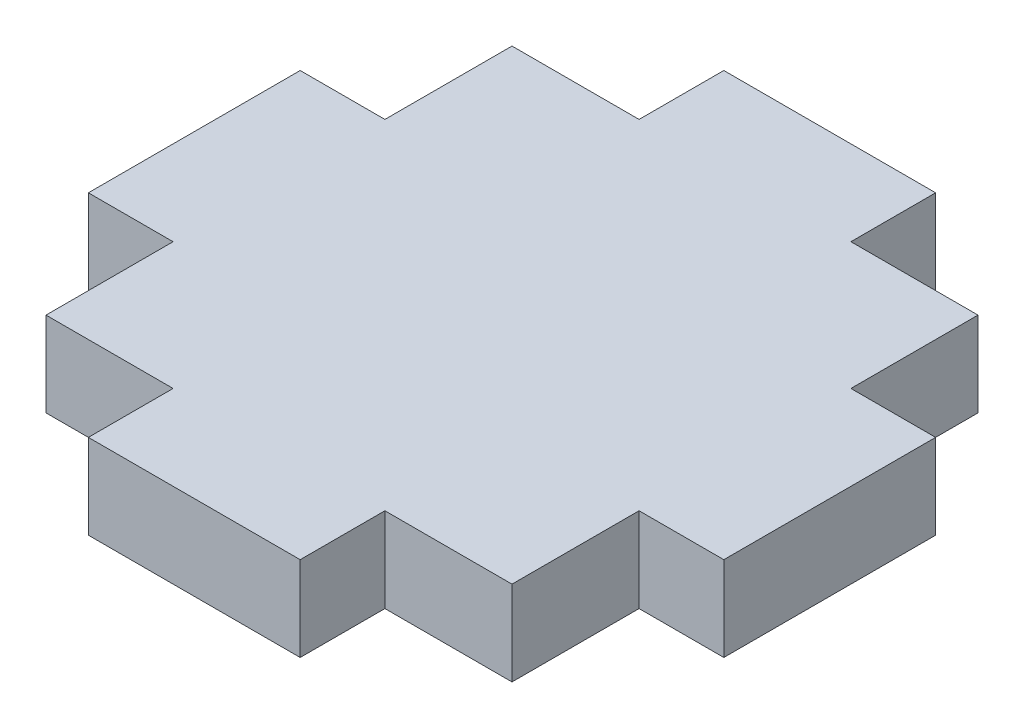
ISO-10303-21;
HEADER;
FILE_DESCRIPTION(('STEP AP214'),'2;1');
FILE_NAME('part.step','',(''),(''),'','','');
FILE_SCHEMA(('AUTOMOTIVE_DESIGN { 1 0 10303 214 1 1 1 1 }'));
ENDSEC;
DATA;
#1=APPLICATION_CONTEXT('core data for automotive mechanical design processes');
#2=APPLICATION_PROTOCOL_DEFINITION('international standard','automotive_design',2000,#1);
#3=PRODUCT_CONTEXT('',#1,'mechanical');
#4=PRODUCT('Part','Part','',(#3));
#5=PRODUCT_RELATED_PRODUCT_CATEGORY('part','',(#4));
#6=PRODUCT_DEFINITION_FORMATION('','',#4);
#7=PRODUCT_DEFINITION_CONTEXT('part definition',#1,'design');
#8=PRODUCT_DEFINITION('design','',#6,#7);
#9=PRODUCT_DEFINITION_SHAPE('','',#8);
#10=(LENGTH_UNIT() NAMED_UNIT(*) SI_UNIT(.MILLI.,.METRE.));
#11=(NAMED_UNIT(*) PLANE_ANGLE_UNIT() SI_UNIT($,.RADIAN.));
#12=(NAMED_UNIT(*) SI_UNIT($,.STERADIAN.) SOLID_ANGLE_UNIT());
#13=UNCERTAINTY_MEASURE_WITH_UNIT(LENGTH_MEASURE(1.E-05),#10,'distance_accuracy_value','');
#14=(GEOMETRIC_REPRESENTATION_CONTEXT(3) GLOBAL_UNCERTAINTY_ASSIGNED_CONTEXT((#13)) GLOBAL_UNIT_ASSIGNED_CONTEXT((#10,
#11,#12)) REPRESENTATION_CONTEXT('',''));
#15=CARTESIAN_POINT('',(0.,0.,0.));
#16=DIRECTION('',(0.,0.,1.));
#17=DIRECTION('',(1.,0.,0.));
#18=AXIS2_PLACEMENT_3D('',#15,#16,#17);
#19=CARTESIAN_POINT('',(26.,4.,0.));
#20=DIRECTION('',(-1.,0.,0.));
#21=DIRECTION('',(0.,0.,1.));
#22=AXIS2_PLACEMENT_3D('',#19,#20,#21);
#23=PLANE('',#22);
#24=DIRECTION('',(0.,0.,-1.));
#25=VECTOR('',#24,1.);
#26=CARTESIAN_POINT('',(26.,0.,0.));
#27=LINE('',#26,#25);
#28=CARTESIAN_POINT('',(26.,0.,-4.));
#29=VERTEX_POINT('',#28);
#30=CARTESIAN_POINT('',(26.,0.,-10.));
#31=VERTEX_POINT('',#30);
#32=EDGE_CURVE('E204',#29,#31,#27,.T.);
#33=ORIENTED_EDGE('',*,*,#32,.T.);
#34=DIRECTION('',(0.,-1.,0.));
#35=VECTOR('',#34,1.);
#36=CARTESIAN_POINT('',(26.,4.,-10.));
#37=LINE('',#36,#35);
#38=CARTESIAN_POINT('',(26.,4.,-10.));
#39=VERTEX_POINT('',#38);
#40=EDGE_CURVE('E11',#39,#31,#37,.T.);
#41=ORIENTED_EDGE('',*,*,#40,.F.);
#42=DIRECTION('',(0.,0.,-1.));
#43=VECTOR('',#42,1.);
#44=CARTESIAN_POINT('',(26.,4.,0.));
#45=LINE('',#44,#43);
#46=CARTESIAN_POINT('',(26.,4.,-4.));
#47=VERTEX_POINT('',#46);
#48=EDGE_CURVE('E306',#47,#39,#45,.T.);
#49=ORIENTED_EDGE('',*,*,#48,.F.);
#50=DIRECTION('',(0.,-1.,0.));
#51=VECTOR('',#50,1.);
#52=CARTESIAN_POINT('',(26.,4.,-4.));
#53=LINE('',#52,#51);
#54=EDGE_CURVE('E199',#47,#29,#53,.T.);
#55=ORIENTED_EDGE('',*,*,#54,.T.);
#56=EDGE_LOOP('',(#33,#41,#49,#55));
#57=FACE_BOUND('',#56,.T.);
#58=ADVANCED_FACE('F35',(#57),#23,.F.);
#59=CARTESIAN_POINT('',(0.,4.,-10.));
#60=DIRECTION('',(0.,0.,-1.));
#61=DIRECTION('',(-1.,0.,0.));
#62=AXIS2_PLACEMENT_3D('',#59,#60,#61);
#63=PLANE('',#62);
#64=DIRECTION('',(1.,0.,0.));
#65=VECTOR('',#64,1.);
#66=CARTESIAN_POINT('',(0.,0.,-10.));
#67=LINE('',#66,#65);
#68=CARTESIAN_POINT('',(30.,0.,-10.));
#69=VERTEX_POINT('',#68);
#70=EDGE_CURVE('E207',#31,#69,#67,.T.);
#71=ORIENTED_EDGE('',*,*,#70,.T.);
#72=DIRECTION('',(0.,-1.,0.));
#73=VECTOR('',#72,1.);
#74=CARTESIAN_POINT('',(30.,4.,-10.));
#75=LINE('',#74,#73);
#76=CARTESIAN_POINT('',(30.,4.,-10.));
#77=VERTEX_POINT('',#76);
#78=EDGE_CURVE('E44',#77,#69,#75,.T.);
#79=ORIENTED_EDGE('',*,*,#78,.F.);
#80=DIRECTION('',(1.,0.,0.));
#81=VECTOR('',#80,1.);
#82=CARTESIAN_POINT('',(0.,4.,-10.));
#83=LINE('',#82,#81);
#84=EDGE_CURVE('E127',#39,#77,#83,.T.);
#85=ORIENTED_EDGE('',*,*,#84,.F.);
#86=ORIENTED_EDGE('',*,*,#40,.T.);
#87=EDGE_LOOP('',(#71,#79,#85,#86));
#88=FACE_BOUND('',#87,.T.);
#89=ADVANCED_FACE('F37',(#88),#63,.F.);
#90=CARTESIAN_POINT('',(30.,4.,0.));
#91=DIRECTION('',(-1.,0.,0.));
#92=DIRECTION('',(0.,0.,1.));
#93=AXIS2_PLACEMENT_3D('',#90,#91,#92);
#94=PLANE('',#93);
#95=DIRECTION('',(0.,0.,-1.));
#96=VECTOR('',#95,1.);
#97=CARTESIAN_POINT('',(30.,0.,0.));
#98=LINE('',#97,#96);
#99=CARTESIAN_POINT('',(30.,0.,-20.));
#100=VERTEX_POINT('',#99);
#101=EDGE_CURVE('E210',#69,#100,#98,.T.);
#102=ORIENTED_EDGE('',*,*,#101,.T.);
#103=DIRECTION('',(0.,-1.,0.));
#104=VECTOR('',#103,1.);
#105=CARTESIAN_POINT('',(30.,4.,-20.));
#106=LINE('',#105,#104);
#107=CARTESIAN_POINT('',(30.,4.,-20.));
#108=VERTEX_POINT('',#107);
#109=EDGE_CURVE('E282',#108,#100,#106,.T.);
#110=ORIENTED_EDGE('',*,*,#109,.F.);
#111=DIRECTION('',(0.,0.,-1.));
#112=VECTOR('',#111,1.);
#113=CARTESIAN_POINT('',(30.,4.,0.));
#114=LINE('',#113,#112);
#115=EDGE_CURVE('E289',#77,#108,#114,.T.);
#116=ORIENTED_EDGE('',*,*,#115,.F.);
#117=ORIENTED_EDGE('',*,*,#78,.T.);
#118=EDGE_LOOP('',(#102,#110,#116,#117));
#119=FACE_BOUND('',#118,.T.);
#120=ADVANCED_FACE('F287',(#119),#94,.F.);
#121=CARTESIAN_POINT('',(0.,4.,-20.));
#122=DIRECTION('',(0.,0.,-1.));
#123=DIRECTION('',(-1.,0.,0.));
#124=AXIS2_PLACEMENT_3D('',#121,#122,#123);
#125=PLANE('',#124);
#126=DIRECTION('',(1.,0.,0.));
#127=VECTOR('',#126,1.);
#128=CARTESIAN_POINT('',(0.,0.,-20.));
#129=LINE('',#128,#127);
#130=CARTESIAN_POINT('',(26.,0.,-20.));
#131=VERTEX_POINT('',#130);
#132=EDGE_CURVE('E213',#131,#100,#129,.T.);
#133=ORIENTED_EDGE('',*,*,#132,.F.);
#134=DIRECTION('',(0.,-1.,0.));
#135=VECTOR('',#134,1.);
#136=CARTESIAN_POINT('',(26.,4.,-20.));
#137=LINE('',#136,#135);
#138=CARTESIAN_POINT('',(26.,4.,-20.));
#139=VERTEX_POINT('',#138);
#140=EDGE_CURVE('E280',#139,#131,#137,.T.);
#141=ORIENTED_EDGE('',*,*,#140,.F.);
#142=DIRECTION('',(1.,0.,0.));
#143=VECTOR('',#142,1.);
#144=CARTESIAN_POINT('',(0.,4.,-20.));
#145=LINE('',#144,#143);
#146=EDGE_CURVE('E301',#139,#108,#145,.T.);
#147=ORIENTED_EDGE('',*,*,#146,.T.);
#148=ORIENTED_EDGE('',*,*,#109,.T.);
#149=EDGE_LOOP('',(#133,#141,#147,#148));
#150=FACE_BOUND('',#149,.T.);
#151=ADVANCED_FACE('F297',(#150),#125,.T.);
#152=CARTESIAN_POINT('',(26.,0.,-26.));
#153=VERTEX_POINT('',#152);
#154=EDGE_CURVE('E208',#131,#153,#27,.T.);
#155=ORIENTED_EDGE('',*,*,#154,.T.);
#156=DIRECTION('',(0.,-1.,0.));
#157=VECTOR('',#156,1.);
#158=CARTESIAN_POINT('',(26.,4.,-26.));
#159=LINE('',#158,#157);
#160=CARTESIAN_POINT('',(26.,4.,-26.));
#161=VERTEX_POINT('',#160);
#162=EDGE_CURVE('E277',#161,#153,#159,.T.);
#163=ORIENTED_EDGE('',*,*,#162,.F.);
#164=EDGE_CURVE('E302',#139,#161,#45,.T.);
#165=ORIENTED_EDGE('',*,*,#164,.F.);
#166=ORIENTED_EDGE('',*,*,#140,.T.);
#167=EDGE_LOOP('',(#155,#163,#165,#166));
#168=FACE_BOUND('',#167,.T.);
#169=ADVANCED_FACE('F355',(#168),#23,.F.);
#170=CARTESIAN_POINT('',(0.,4.,-26.));
#171=DIRECTION('',(0.,0.,1.));
#172=DIRECTION('',(1.,0.,0.));
#173=AXIS2_PLACEMENT_3D('',#170,#171,#172);
#174=PLANE('',#173);
#175=DIRECTION('',(-1.,0.,0.));
#176=VECTOR('',#175,1.);
#177=CARTESIAN_POINT('',(0.,0.,-26.));
#178=LINE('',#177,#176);
#179=CARTESIAN_POINT('',(20.,0.,-26.));
#180=VERTEX_POINT('',#179);
#181=EDGE_CURVE('E216',#153,#180,#178,.T.);
#182=ORIENTED_EDGE('',*,*,#181,.T.);
#183=DIRECTION('',(0.,-1.,0.));
#184=VECTOR('',#183,1.);
#185=CARTESIAN_POINT('',(20.,4.,-26.));
#186=LINE('',#185,#184);
#187=CARTESIAN_POINT('',(20.,4.,-26.));
#188=VERTEX_POINT('',#187);
#189=EDGE_CURVE('E274',#188,#180,#186,.T.);
#190=ORIENTED_EDGE('',*,*,#189,.F.);
#191=DIRECTION('',(-1.,0.,0.));
#192=VECTOR('',#191,1.);
#193=CARTESIAN_POINT('',(0.,4.,-26.));
#194=LINE('',#193,#192);
#195=EDGE_CURVE('E304',#161,#188,#194,.T.);
#196=ORIENTED_EDGE('',*,*,#195,.F.);
#197=ORIENTED_EDGE('',*,*,#162,.T.);
#198=EDGE_LOOP('',(#182,#190,#196,#197));
#199=FACE_BOUND('',#198,.T.);
#200=ADVANCED_FACE('F361',(#199),#174,.F.);
#201=CARTESIAN_POINT('',(20.,4.,0.));
#202=DIRECTION('',(-1.,0.,0.));
#203=DIRECTION('',(0.,0.,1.));
#204=AXIS2_PLACEMENT_3D('',#201,#202,#203);
#205=PLANE('',#204);
#206=DIRECTION('',(0.,0.,-1.));
#207=VECTOR('',#206,1.);
#208=CARTESIAN_POINT('',(20.,0.,0.));
#209=LINE('',#208,#207);
#210=CARTESIAN_POINT('',(20.,0.,-30.));
#211=VERTEX_POINT('',#210);
#212=EDGE_CURVE('E218',#180,#211,#209,.T.);
#213=ORIENTED_EDGE('',*,*,#212,.T.);
#214=DIRECTION('',(0.,-1.,0.));
#215=VECTOR('',#214,1.);
#216=CARTESIAN_POINT('',(20.,4.,-30.));
#217=LINE('',#216,#215);
#218=CARTESIAN_POINT('',(20.,4.,-30.));
#219=VERTEX_POINT('',#218);
#220=EDGE_CURVE('E272',#219,#211,#217,.T.);
#221=ORIENTED_EDGE('',*,*,#220,.F.);
#222=DIRECTION('',(0.,0.,-1.));
#223=VECTOR('',#222,1.);
#224=CARTESIAN_POINT('',(20.,4.,0.));
#225=LINE('',#224,#223);
#226=EDGE_CURVE('E311',#188,#219,#225,.T.);
#227=ORIENTED_EDGE('',*,*,#226,.F.);
#228=ORIENTED_EDGE('',*,*,#189,.T.);
#229=EDGE_LOOP('',(#213,#221,#227,#228));
#230=FACE_BOUND('',#229,.T.);
#231=ADVANCED_FACE('F367',(#230),#205,.F.);
#232=CARTESIAN_POINT('',(0.,4.,-30.));
#233=DIRECTION('',(0.,0.,-1.));
#234=DIRECTION('',(-1.,0.,0.));
#235=AXIS2_PLACEMENT_3D('',#232,#233,#234);
#236=PLANE('',#235);
#237=DIRECTION('',(1.,0.,0.));
#238=VECTOR('',#237,1.);
#239=CARTESIAN_POINT('',(0.,0.,-30.));
#240=LINE('',#239,#238);
#241=CARTESIAN_POINT('',(10.,0.,-30.));
#242=VERTEX_POINT('',#241);
#243=EDGE_CURVE('E222',#242,#211,#240,.T.);
#244=ORIENTED_EDGE('',*,*,#243,.F.);
#245=DIRECTION('',(0.,-1.,0.));
#246=VECTOR('',#245,1.);
#247=CARTESIAN_POINT('',(10.,4.,-30.));
#248=LINE('',#247,#246);
#249=CARTESIAN_POINT('',(10.,4.,-30.));
#250=VERTEX_POINT('',#249);
#251=EDGE_CURVE('E270',#250,#242,#248,.T.);
#252=ORIENTED_EDGE('',*,*,#251,.F.);
#253=DIRECTION('',(1.,0.,0.));
#254=VECTOR('',#253,1.);
#255=CARTESIAN_POINT('',(0.,4.,-30.));
#256=LINE('',#255,#254);
#257=EDGE_CURVE('E314',#250,#219,#256,.T.);
#258=ORIENTED_EDGE('',*,*,#257,.T.);
#259=ORIENTED_EDGE('',*,*,#220,.T.);
#260=EDGE_LOOP('',(#244,#252,#258,#259));
#261=FACE_BOUND('',#260,.T.);
#262=ADVANCED_FACE('F419',(#261),#236,.T.);
#263=CARTESIAN_POINT('',(10.,4.,0.));
#264=DIRECTION('',(-1.,0.,0.));
#265=DIRECTION('',(0.,0.,1.));
#266=AXIS2_PLACEMENT_3D('',#263,#264,#265);
#267=PLANE('',#266);
#268=DIRECTION('',(0.,0.,-1.));
#269=VECTOR('',#268,1.);
#270=CARTESIAN_POINT('',(10.,0.,0.));
#271=LINE('',#270,#269);
#272=CARTESIAN_POINT('',(10.,0.,-26.));
#273=VERTEX_POINT('',#272);
#274=EDGE_CURVE('E225',#273,#242,#271,.T.);
#275=ORIENTED_EDGE('',*,*,#274,.F.);
#276=DIRECTION('',(0.,-1.,0.));
#277=VECTOR('',#276,1.);
#278=CARTESIAN_POINT('',(10.,4.,-26.));
#279=LINE('',#278,#277);
#280=CARTESIAN_POINT('',(10.,4.,-26.));
#281=VERTEX_POINT('',#280);
#282=EDGE_CURVE('E268',#281,#273,#279,.T.);
#283=ORIENTED_EDGE('',*,*,#282,.F.);
#284=DIRECTION('',(0.,0.,-1.));
#285=VECTOR('',#284,1.);
#286=CARTESIAN_POINT('',(10.,4.,0.));
#287=LINE('',#286,#285);
#288=EDGE_CURVE('E317',#281,#250,#287,.T.);
#289=ORIENTED_EDGE('',*,*,#288,.T.);
#290=ORIENTED_EDGE('',*,*,#251,.T.);
#291=EDGE_LOOP('',(#275,#283,#289,#290));
#292=FACE_BOUND('',#291,.T.);
#293=ADVANCED_FACE('F384',(#292),#267,.T.);
#294=CARTESIAN_POINT('',(4.,0.,-26.));
#295=VERTEX_POINT('',#294);
#296=EDGE_CURVE('E219',#273,#295,#178,.T.);
#297=ORIENTED_EDGE('',*,*,#296,.T.);
#298=DIRECTION('',(0.,-1.,0.));
#299=VECTOR('',#298,1.);
#300=CARTESIAN_POINT('',(4.,4.,-26.));
#301=LINE('',#300,#299);
#302=CARTESIAN_POINT('',(4.,4.,-26.));
#303=VERTEX_POINT('',#302);
#304=EDGE_CURVE('E265',#303,#295,#301,.T.);
#305=ORIENTED_EDGE('',*,*,#304,.F.);
#306=EDGE_CURVE('E312',#281,#303,#194,.T.);
#307=ORIENTED_EDGE('',*,*,#306,.F.);
#308=ORIENTED_EDGE('',*,*,#282,.T.);
#309=EDGE_LOOP('',(#297,#305,#307,#308));
#310=FACE_BOUND('',#309,.T.);
#311=ADVANCED_FACE('F370',(#310),#174,.F.);
#312=CARTESIAN_POINT('',(4.,4.,0.));
#313=DIRECTION('',(1.,0.,0.));
#314=DIRECTION('',(0.,0.,-1.));
#315=AXIS2_PLACEMENT_3D('',#312,#313,#314);
#316=PLANE('',#315);
#317=DIRECTION('',(0.,0.,1.));
#318=VECTOR('',#317,1.);
#319=CARTESIAN_POINT('',(4.,0.,0.));
#320=LINE('',#319,#318);
#321=CARTESIAN_POINT('',(4.,0.,-20.));
#322=VERTEX_POINT('',#321);
#323=EDGE_CURVE('E228',#295,#322,#320,.T.);
#324=ORIENTED_EDGE('',*,*,#323,.T.);
#325=DIRECTION('',(0.,-1.,0.));
#326=VECTOR('',#325,1.);
#327=CARTESIAN_POINT('',(4.,4.,-20.));
#328=LINE('',#327,#326);
#329=CARTESIAN_POINT('',(4.,4.,-20.));
#330=VERTEX_POINT('',#329);
#331=EDGE_CURVE('E263',#330,#322,#328,.T.);
#332=ORIENTED_EDGE('',*,*,#331,.F.);
#333=DIRECTION('',(0.,0.,1.));
#334=VECTOR('',#333,1.);
#335=CARTESIAN_POINT('',(4.,4.,0.));
#336=LINE('',#335,#334);
#337=EDGE_CURVE('E320',#303,#330,#336,.T.);
#338=ORIENTED_EDGE('',*,*,#337,.F.);
#339=ORIENTED_EDGE('',*,*,#304,.T.);
#340=EDGE_LOOP('',(#324,#332,#338,#339));
#341=FACE_BOUND('',#340,.T.);
#342=ADVANCED_FACE('F393',(#341),#316,.F.);
#343=CARTESIAN_POINT('',(0.,4.,-20.));
#344=DIRECTION('',(0.,0.,-1.));
#345=DIRECTION('',(-1.,0.,0.));
#346=AXIS2_PLACEMENT_3D('',#343,#344,#345);
#347=PLANE('',#346);
#348=DIRECTION('',(1.,0.,0.));
#349=VECTOR('',#348,1.);
#350=CARTESIAN_POINT('',(0.,0.,-20.));
#351=LINE('',#350,#349);
#352=CARTESIAN_POINT('',(0.,0.,-20.));
#353=VERTEX_POINT('',#352);
#354=EDGE_CURVE('E231',#353,#322,#351,.T.);
#355=ORIENTED_EDGE('',*,*,#354,.F.);
#356=DIRECTION('',(0.,-1.,0.));
#357=VECTOR('',#356,1.);
#358=CARTESIAN_POINT('',(0.,4.,-20.));
#359=LINE('',#358,#357);
#360=CARTESIAN_POINT('',(0.,4.,-20.));
#361=VERTEX_POINT('',#360);
#362=EDGE_CURVE('E261',#361,#353,#359,.T.);
#363=ORIENTED_EDGE('',*,*,#362,.F.);
#364=DIRECTION('',(1.,0.,0.));
#365=VECTOR('',#364,1.);
#366=CARTESIAN_POINT('',(0.,4.,-20.));
#367=LINE('',#366,#365);
#368=EDGE_CURVE('E322',#361,#330,#367,.T.);
#369=ORIENTED_EDGE('',*,*,#368,.T.);
#370=ORIENTED_EDGE('',*,*,#331,.T.);
#371=EDGE_LOOP('',(#355,#363,#369,#370));
#372=FACE_BOUND('',#371,.T.);
#373=ADVANCED_FACE('F397',(#372),#347,.T.);
#374=CARTESIAN_POINT('',(0.,4.,0.));
#375=DIRECTION('',(-1.,0.,0.));
#376=DIRECTION('',(0.,0.,1.));
#377=AXIS2_PLACEMENT_3D('',#374,#375,#376);
#378=PLANE('',#377);
#379=DIRECTION('',(0.,0.,-1.));
#380=VECTOR('',#379,1.);
#381=CARTESIAN_POINT('',(0.,0.,0.));
#382=LINE('',#381,#380);
#383=CARTESIAN_POINT('',(0.,0.,-10.));
#384=VERTEX_POINT('',#383);
#385=EDGE_CURVE('E235',#384,#353,#382,.T.);
#386=ORIENTED_EDGE('',*,*,#385,.F.);
#387=DIRECTION('',(0.,-1.,0.));
#388=VECTOR('',#387,1.);
#389=CARTESIAN_POINT('',(0.,4.,-10.));
#390=LINE('',#389,#388);
#391=CARTESIAN_POINT('',(0.,4.,-10.));
#392=VERTEX_POINT('',#391);
#393=EDGE_CURVE('E259',#392,#384,#390,.T.);
#394=ORIENTED_EDGE('',*,*,#393,.F.);
#395=DIRECTION('',(0.,0.,-1.));
#396=VECTOR('',#395,1.);
#397=CARTESIAN_POINT('',(0.,4.,0.));
#398=LINE('',#397,#396);
#399=EDGE_CURVE('E326',#392,#361,#398,.T.);
#400=ORIENTED_EDGE('',*,*,#399,.T.);
#401=ORIENTED_EDGE('',*,*,#362,.T.);
#402=EDGE_LOOP('',(#386,#394,#400,#401));
#403=FACE_BOUND('',#402,.T.);
#404=ADVANCED_FACE('F400',(#403),#378,.T.);
#405=CARTESIAN_POINT('',(0.,4.,-10.));
#406=DIRECTION('',(0.,0.,-1.));
#407=DIRECTION('',(-1.,0.,0.));
#408=AXIS2_PLACEMENT_3D('',#405,#406,#407);
#409=PLANE('',#408);
#410=DIRECTION('',(1.,0.,0.));
#411=VECTOR('',#410,1.);
#412=CARTESIAN_POINT('',(0.,0.,-10.));
#413=LINE('',#412,#411);
#414=CARTESIAN_POINT('',(4.,0.,-10.));
#415=VERTEX_POINT('',#414);
#416=EDGE_CURVE('E238',#384,#415,#413,.T.);
#417=ORIENTED_EDGE('',*,*,#416,.T.);
#418=DIRECTION('',(0.,-1.,0.));
#419=VECTOR('',#418,1.);
#420=CARTESIAN_POINT('',(4.,4.,-10.));
#421=LINE('',#420,#419);
#422=CARTESIAN_POINT('',(4.,4.,-10.));
#423=VERTEX_POINT('',#422);
#424=EDGE_CURVE('E256',#423,#415,#421,.T.);
#425=ORIENTED_EDGE('',*,*,#424,.F.);
#426=DIRECTION('',(1.,0.,0.));
#427=VECTOR('',#426,1.);
#428=CARTESIAN_POINT('',(0.,4.,-10.));
#429=LINE('',#428,#427);
#430=EDGE_CURVE('E329',#392,#423,#429,.T.);
#431=ORIENTED_EDGE('',*,*,#430,.F.);
#432=ORIENTED_EDGE('',*,*,#393,.T.);
#433=EDGE_LOOP('',(#417,#425,#431,#432));
#434=FACE_BOUND('',#433,.T.);
#435=ADVANCED_FACE('F403',(#434),#409,.F.);
#436=CARTESIAN_POINT('',(4.,0.,-4.));
#437=VERTEX_POINT('',#436);
#438=EDGE_CURVE('E232',#415,#437,#320,.T.);
#439=ORIENTED_EDGE('',*,*,#438,.T.);
#440=DIRECTION('',(0.,-1.,0.));
#441=VECTOR('',#440,1.);
#442=CARTESIAN_POINT('',(4.,4.,-4.));
#443=LINE('',#442,#441);
#444=CARTESIAN_POINT('',(4.,4.,-4.));
#445=VERTEX_POINT('',#444);
#446=EDGE_CURVE('E253',#445,#437,#443,.T.);
#447=ORIENTED_EDGE('',*,*,#446,.F.);
#448=EDGE_CURVE('E323',#423,#445,#336,.T.);
#449=ORIENTED_EDGE('',*,*,#448,.F.);
#450=ORIENTED_EDGE('',*,*,#424,.T.);
#451=EDGE_LOOP('',(#439,#447,#449,#450));
#452=FACE_BOUND('',#451,.T.);
#453=ADVANCED_FACE('F338',(#452),#316,.F.);
#454=CARTESIAN_POINT('',(0.,4.,-4.));
#455=DIRECTION('',(0.,0.,-1.));
#456=DIRECTION('',(-1.,0.,0.));
#457=AXIS2_PLACEMENT_3D('',#454,#455,#456);
#458=PLANE('',#457);
#459=DIRECTION('',(1.,0.,0.));
#460=VECTOR('',#459,1.);
#461=CARTESIAN_POINT('',(0.,0.,-4.));
#462=LINE('',#461,#460);
#463=CARTESIAN_POINT('',(10.,0.,-4.));
#464=VERTEX_POINT('',#463);
#465=EDGE_CURVE('E240',#437,#464,#462,.T.);
#466=ORIENTED_EDGE('',*,*,#465,.T.);
#467=DIRECTION('',(0.,-1.,0.));
#468=VECTOR('',#467,1.);
#469=CARTESIAN_POINT('',(10.,4.,-4.));
#470=LINE('',#469,#468);
#471=CARTESIAN_POINT('',(10.,4.,-4.));
#472=VERTEX_POINT('',#471);
#473=EDGE_CURVE('E250',#472,#464,#470,.T.);
#474=ORIENTED_EDGE('',*,*,#473,.F.);
#475=DIRECTION('',(1.,0.,0.));
#476=VECTOR('',#475,1.);
#477=CARTESIAN_POINT('',(0.,4.,-4.));
#478=LINE('',#477,#476);
#479=EDGE_CURVE('E201',#445,#472,#478,.T.);
#480=ORIENTED_EDGE('',*,*,#479,.F.);
#481=ORIENTED_EDGE('',*,*,#446,.T.);
#482=EDGE_LOOP('',(#466,#474,#480,#481));
#483=FACE_BOUND('',#482,.T.);
#484=ADVANCED_FACE('F342',(#483),#458,.F.);
#485=CARTESIAN_POINT('',(10.,4.,0.));
#486=DIRECTION('',(1.,0.,0.));
#487=DIRECTION('',(0.,0.,-1.));
#488=AXIS2_PLACEMENT_3D('',#485,#486,#487);
#489=PLANE('',#488);
#490=DIRECTION('',(0.,0.,1.));
#491=VECTOR('',#490,1.);
#492=CARTESIAN_POINT('',(10.,0.,0.));
#493=LINE('',#492,#491);
#494=CARTESIAN_POINT('',(10.,0.,0.));
#495=VERTEX_POINT('',#494);
#496=EDGE_CURVE('E242',#464,#495,#493,.T.);
#497=ORIENTED_EDGE('',*,*,#496,.T.);
#498=DIRECTION('',(0.,-1.,0.));
#499=VECTOR('',#498,1.);
#500=CARTESIAN_POINT('',(10.,4.,0.));
#501=LINE('',#500,#499);
#502=CARTESIAN_POINT('',(10.,4.,0.));
#503=VERTEX_POINT('',#502);
#504=EDGE_CURVE('E195',#503,#495,#501,.T.);
#505=ORIENTED_EDGE('',*,*,#504,.F.);
#506=DIRECTION('',(0.,0.,1.));
#507=VECTOR('',#506,1.);
#508=CARTESIAN_POINT('',(10.,4.,0.));
#509=LINE('',#508,#507);
#510=EDGE_CURVE('E182',#472,#503,#509,.T.);
#511=ORIENTED_EDGE('',*,*,#510,.F.);
#512=ORIENTED_EDGE('',*,*,#473,.T.);
#513=EDGE_LOOP('',(#497,#505,#511,#512));
#514=FACE_BOUND('',#513,.T.);
#515=ADVANCED_FACE('F345',(#514),#489,.F.);
#516=CARTESIAN_POINT('',(0.,4.,0.));
#517=DIRECTION('',(0.,0.,-1.));
#518=DIRECTION('',(-1.,0.,0.));
#519=AXIS2_PLACEMENT_3D('',#516,#517,#518);
#520=PLANE('',#519);
#521=DIRECTION('',(1.,0.,0.));
#522=VECTOR('',#521,1.);
#523=CARTESIAN_POINT('',(0.,0.,0.));
#524=LINE('',#523,#522);
#525=CARTESIAN_POINT('',(20.,0.,0.));
#526=VERTEX_POINT('',#525);
#527=EDGE_CURVE('E191',#495,#526,#524,.T.);
#528=ORIENTED_EDGE('',*,*,#527,.T.);
#529=DIRECTION('',(0.,-1.,0.));
#530=VECTOR('',#529,1.);
#531=CARTESIAN_POINT('',(20.,4.,0.));
#532=LINE('',#531,#530);
#533=CARTESIAN_POINT('',(20.,4.,0.));
#534=VERTEX_POINT('',#533);
#535=EDGE_CURVE('E188',#534,#526,#532,.T.);
#536=ORIENTED_EDGE('',*,*,#535,.F.);
#537=DIRECTION('',(1.,0.,0.));
#538=VECTOR('',#537,1.);
#539=CARTESIAN_POINT('',(0.,4.,0.));
#540=LINE('',#539,#538);
#541=EDGE_CURVE('E176',#503,#534,#540,.T.);
#542=ORIENTED_EDGE('',*,*,#541,.F.);
#543=ORIENTED_EDGE('',*,*,#504,.T.);
#544=EDGE_LOOP('',(#528,#536,#542,#543));
#545=FACE_BOUND('',#544,.T.);
#546=ADVANCED_FACE('F189',(#545),#520,.F.);
#547=CARTESIAN_POINT('',(20.,4.,0.));
#548=DIRECTION('',(1.,0.,0.));
#549=DIRECTION('',(0.,0.,-1.));
#550=AXIS2_PLACEMENT_3D('',#547,#548,#549);
#551=PLANE('',#550);
#552=DIRECTION('',(0.,0.,1.));
#553=VECTOR('',#552,1.);
#554=CARTESIAN_POINT('',(20.,0.,0.));
#555=LINE('',#554,#553);
#556=CARTESIAN_POINT('',(20.,0.,-4.));
#557=VERTEX_POINT('',#556);
#558=EDGE_CURVE('E245',#557,#526,#555,.T.);
#559=ORIENTED_EDGE('',*,*,#558,.F.);
#560=DIRECTION('',(0.,-1.,0.));
#561=VECTOR('',#560,1.);
#562=CARTESIAN_POINT('',(20.,4.,-4.));
#563=LINE('',#562,#561);
#564=CARTESIAN_POINT('',(20.,4.,-4.));
#565=VERTEX_POINT('',#564);
#566=EDGE_CURVE('E116',#565,#557,#563,.T.);
#567=ORIENTED_EDGE('',*,*,#566,.F.);
#568=DIRECTION('',(0.,0.,1.));
#569=VECTOR('',#568,1.);
#570=CARTESIAN_POINT('',(20.,4.,0.));
#571=LINE('',#570,#569);
#572=EDGE_CURVE('E180',#565,#534,#571,.T.);
#573=ORIENTED_EDGE('',*,*,#572,.T.);
#574=ORIENTED_EDGE('',*,*,#535,.T.);
#575=EDGE_LOOP('',(#559,#567,#573,#574));
#576=FACE_BOUND('',#575,.T.);
#577=ADVANCED_FACE('F197',(#576),#551,.T.);
#578=EDGE_CURVE('E119',#557,#29,#462,.T.);
#579=ORIENTED_EDGE('',*,*,#578,.T.);
#580=ORIENTED_EDGE('',*,*,#54,.F.);
#581=EDGE_CURVE('E52',#565,#47,#478,.T.);
#582=ORIENTED_EDGE('',*,*,#581,.F.);
#583=ORIENTED_EDGE('',*,*,#566,.T.);
#584=EDGE_LOOP('',(#579,#580,#582,#583));
#585=FACE_BOUND('',#584,.T.);
#586=ADVANCED_FACE('F474',(#585),#458,.F.);
#587=CARTESIAN_POINT('',(0.,4.,0.));
#588=DIRECTION('',(0.,1.,0.));
#589=DIRECTION('',(0.,0.,1.));
#590=AXIS2_PLACEMENT_3D('',#587,#588,#589);
#591=PLANE('',#590);
#592=ORIENTED_EDGE('',*,*,#48,.T.);
#593=ORIENTED_EDGE('',*,*,#84,.T.);
#594=ORIENTED_EDGE('',*,*,#115,.T.);
#595=ORIENTED_EDGE('',*,*,#146,.F.);
#596=ORIENTED_EDGE('',*,*,#164,.T.);
#597=ORIENTED_EDGE('',*,*,#195,.T.);
#598=ORIENTED_EDGE('',*,*,#226,.T.);
#599=ORIENTED_EDGE('',*,*,#257,.F.);
#600=ORIENTED_EDGE('',*,*,#288,.F.);
#601=ORIENTED_EDGE('',*,*,#306,.T.);
#602=ORIENTED_EDGE('',*,*,#337,.T.);
#603=ORIENTED_EDGE('',*,*,#368,.F.);
#604=ORIENTED_EDGE('',*,*,#399,.F.);
#605=ORIENTED_EDGE('',*,*,#430,.T.);
#606=ORIENTED_EDGE('',*,*,#448,.T.);
#607=ORIENTED_EDGE('',*,*,#479,.T.);
#608=ORIENTED_EDGE('',*,*,#510,.T.);
#609=ORIENTED_EDGE('',*,*,#541,.T.);
#610=ORIENTED_EDGE('',*,*,#572,.F.);
#611=ORIENTED_EDGE('',*,*,#581,.T.);
#612=EDGE_LOOP('',(#592,#593,#594,#595,#596,#597,#598,#599,#600,#601,#602,#603,#604,#605,#606,
#607,#608,#609,#610,#611));
#613=FACE_BOUND('',#612,.T.);
#614=ADVANCED_FACE('F178',(#613),#591,.T.);
#615=CARTESIAN_POINT('',(0.,0.,0.));
#616=DIRECTION('',(0.,1.,0.));
#617=DIRECTION('',(0.,0.,1.));
#618=AXIS2_PLACEMENT_3D('',#615,#616,#617);
#619=PLANE('',#618);
#620=ORIENTED_EDGE('',*,*,#32,.F.);
#621=ORIENTED_EDGE('',*,*,#578,.F.);
#622=ORIENTED_EDGE('',*,*,#558,.T.);
#623=ORIENTED_EDGE('',*,*,#527,.F.);
#624=ORIENTED_EDGE('',*,*,#496,.F.);
#625=ORIENTED_EDGE('',*,*,#465,.F.);
#626=ORIENTED_EDGE('',*,*,#438,.F.);
#627=ORIENTED_EDGE('',*,*,#416,.F.);
#628=ORIENTED_EDGE('',*,*,#385,.T.);
#629=ORIENTED_EDGE('',*,*,#354,.T.);
#630=ORIENTED_EDGE('',*,*,#323,.F.);
#631=ORIENTED_EDGE('',*,*,#296,.F.);
#632=ORIENTED_EDGE('',*,*,#274,.T.);
#633=ORIENTED_EDGE('',*,*,#243,.T.);
#634=ORIENTED_EDGE('',*,*,#212,.F.);
#635=ORIENTED_EDGE('',*,*,#181,.F.);
#636=ORIENTED_EDGE('',*,*,#154,.F.);
#637=ORIENTED_EDGE('',*,*,#132,.T.);
#638=ORIENTED_EDGE('',*,*,#101,.F.);
#639=ORIENTED_EDGE('',*,*,#70,.F.);
#640=EDGE_LOOP('',(#620,#621,#622,#623,#624,#625,#626,#627,#628,#629,#630,#631,#632,#633,#634,
#635,#636,#637,#638,#639));
#641=FACE_BOUND('',#640,.T.);
#642=ADVANCED_FACE('F292',(#641),#619,.F.);
#643=CLOSED_SHELL('',(#58,#89,#120,#151,#169,#200,#231,#262,#293,#311,#342,#373,#404,#435,#453,
#484,#515,#546,#577,#586,#614,#642));
#644=MANIFOLD_SOLID_BREP('B2',#643);
#645=ADVANCED_BREP_SHAPE_REPRESENTATION('',(#18,#644),#14);
#646=SHAPE_DEFINITION_REPRESENTATION(#9,#645);
ENDSEC;
END-ISO-10303-21;
